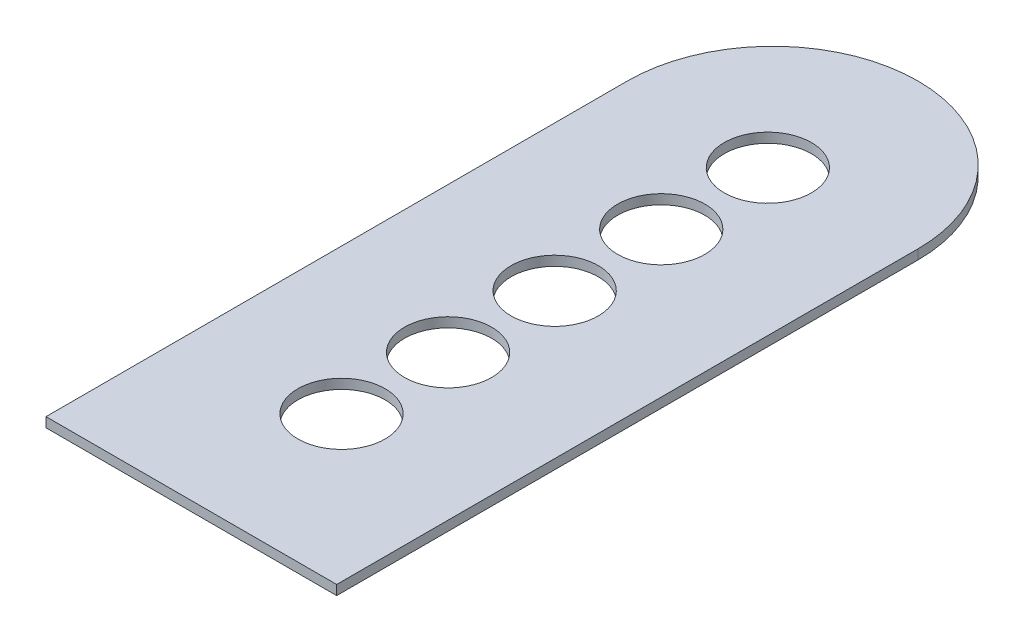
ISO-10303-21;
HEADER;
FILE_DESCRIPTION(('STEP AP214'),'2;1');
FILE_NAME('part.step','',(''),(''),'','','');
FILE_SCHEMA(('AUTOMOTIVE_DESIGN { 1 0 10303 214 1 1 1 1 }'));
ENDSEC;
DATA;
#1=APPLICATION_CONTEXT('core data for automotive mechanical design processes');
#2=APPLICATION_PROTOCOL_DEFINITION('international standard','automotive_design',2000,#1);
#3=PRODUCT_CONTEXT('',#1,'mechanical');
#4=PRODUCT('Part','Part','',(#3));
#5=PRODUCT_RELATED_PRODUCT_CATEGORY('part','',(#4));
#6=PRODUCT_DEFINITION_FORMATION('','',#4);
#7=PRODUCT_DEFINITION_CONTEXT('part definition',#1,'design');
#8=PRODUCT_DEFINITION('design','',#6,#7);
#9=PRODUCT_DEFINITION_SHAPE('','',#8);
#10=(LENGTH_UNIT() NAMED_UNIT(*) SI_UNIT(.MILLI.,.METRE.));
#11=(NAMED_UNIT(*) PLANE_ANGLE_UNIT() SI_UNIT($,.RADIAN.));
#12=(NAMED_UNIT(*) SI_UNIT($,.STERADIAN.) SOLID_ANGLE_UNIT());
#13=UNCERTAINTY_MEASURE_WITH_UNIT(LENGTH_MEASURE(1.E-05),#10,'distance_accuracy_value','');
#14=(GEOMETRIC_REPRESENTATION_CONTEXT(3) GLOBAL_UNCERTAINTY_ASSIGNED_CONTEXT((#13)) GLOBAL_UNIT_ASSIGNED_CONTEXT((#10,
#11,#12)) REPRESENTATION_CONTEXT('',''));
#15=CARTESIAN_POINT('',(0.,0.,0.));
#16=DIRECTION('',(0.,0.,1.));
#17=DIRECTION('',(1.,0.,0.));
#18=AXIS2_PLACEMENT_3D('',#15,#16,#17);
#19=CARTESIAN_POINT('',(150.,10.,-600.));
#20=DIRECTION('',(0.,1.,0.));
#21=DIRECTION('',(0.,0.,1.));
#22=AXIS2_PLACEMENT_3D('',#19,#20,#21);
#23=PLANE('',#22);
#24=CARTESIAN_POINT('',(150.,10.,-485.));
#25=DIRECTION('',(0.,1.,0.));
#26=DIRECTION('',(0.,0.,1.));
#27=AXIS2_PLACEMENT_3D('',#24,#25,#26);
#28=CIRCLE('',#27,45.);
#29=CARTESIAN_POINT('',(150.,10.,-440.));
#30=VERTEX_POINT('',#29);
#31=EDGE_CURVE('E128',#30,#30,#28,.T.);
#32=ORIENTED_EDGE('',*,*,#31,.F.);
#33=EDGE_LOOP('',(#32));
#34=FACE_BOUND('',#33,.T.);
#35=CARTESIAN_POINT('',(150.,10.,-155.));
#36=DIRECTION('',(0.,1.,0.));
#37=DIRECTION('',(0.,0.,1.));
#38=AXIS2_PLACEMENT_3D('',#35,#36,#37);
#39=CIRCLE('',#38,45.);
#40=CARTESIAN_POINT('',(150.,10.,-110.));
#41=VERTEX_POINT('',#40);
#42=EDGE_CURVE('E116',#41,#41,#39,.T.);
#43=ORIENTED_EDGE('',*,*,#42,.F.);
#44=EDGE_LOOP('',(#43));
#45=FACE_BOUND('',#44,.T.);
#46=DIRECTION('',(1.,0.,0.));
#47=VECTOR('',#46,1.);
#48=CARTESIAN_POINT('',(0.,10.,0.));
#49=LINE('',#48,#47);
#50=CARTESIAN_POINT('',(0.,10.,0.));
#51=VERTEX_POINT('',#50);
#52=CARTESIAN_POINT('',(300.,10.,0.));
#53=VERTEX_POINT('',#52);
#54=EDGE_CURVE('E86',#51,#53,#49,.T.);
#55=ORIENTED_EDGE('',*,*,#54,.T.);
#56=DIRECTION('',(0.,0.,-1.));
#57=VECTOR('',#56,1.);
#58=CARTESIAN_POINT('',(300.,10.,0.));
#59=LINE('',#58,#57);
#60=CARTESIAN_POINT('',(300.,10.,-600.));
#61=VERTEX_POINT('',#60);
#62=EDGE_CURVE('E81',#53,#61,#59,.T.);
#63=ORIENTED_EDGE('',*,*,#62,.T.);
#64=CARTESIAN_POINT('',(150.,10.,-600.));
#65=DIRECTION('',(0.,1.,0.));
#66=DIRECTION('',(0.,0.,1.));
#67=AXIS2_PLACEMENT_3D('',#64,#65,#66);
#68=CIRCLE('',#67,150.);
#69=CARTESIAN_POINT('',(0.,10.,-600.));
#70=VERTEX_POINT('',#69);
#71=EDGE_CURVE('E84',#61,#70,#68,.T.);
#72=ORIENTED_EDGE('',*,*,#71,.T.);
#73=DIRECTION('',(0.,0.,1.));
#74=VECTOR('',#73,1.);
#75=CARTESIAN_POINT('',(0.,10.,0.));
#76=LINE('',#75,#74);
#77=EDGE_CURVE('E51',#70,#51,#76,.T.);
#78=ORIENTED_EDGE('',*,*,#77,.T.);
#79=EDGE_LOOP('',(#55,#63,#72,#78));
#80=FACE_BOUND('',#79,.T.);
#81=CARTESIAN_POINT('',(150.,10.,-595.));
#82=DIRECTION('',(0.,1.,0.));
#83=DIRECTION('',(0.,0.,1.));
#84=AXIS2_PLACEMENT_3D('',#81,#82,#83);
#85=CIRCLE('',#84,45.);
#86=CARTESIAN_POINT('',(150.,10.,-550.));
#87=VERTEX_POINT('',#86);
#88=EDGE_CURVE('E101',#87,#87,#85,.T.);
#89=ORIENTED_EDGE('',*,*,#88,.F.);
#90=EDGE_LOOP('',(#89));
#91=FACE_BOUND('',#90,.T.);
#92=CARTESIAN_POINT('',(150.,10.,-265.));
#93=DIRECTION('',(0.,1.,0.));
#94=DIRECTION('',(0.,0.,1.));
#95=AXIS2_PLACEMENT_3D('',#92,#93,#94);
#96=CIRCLE('',#95,45.);
#97=CARTESIAN_POINT('',(150.,10.,-220.));
#98=VERTEX_POINT('',#97);
#99=EDGE_CURVE('E122',#98,#98,#96,.T.);
#100=ORIENTED_EDGE('',*,*,#99,.F.);
#101=EDGE_LOOP('',(#100));
#102=FACE_BOUND('',#101,.T.);
#103=CARTESIAN_POINT('',(150.,10.,-375.));
#104=DIRECTION('',(0.,1.,0.));
#105=DIRECTION('',(0.,0.,1.));
#106=AXIS2_PLACEMENT_3D('',#103,#104,#105);
#107=CIRCLE('',#106,45.);
#108=CARTESIAN_POINT('',(150.,10.,-330.));
#109=VERTEX_POINT('',#108);
#110=EDGE_CURVE('E134',#109,#109,#107,.T.);
#111=ORIENTED_EDGE('',*,*,#110,.F.);
#112=EDGE_LOOP('',(#111));
#113=FACE_BOUND('',#112,.T.);
#114=ADVANCED_FACE('F34',(#34,#45,#80,#91,#102,#113),#23,.T.);
#115=CARTESIAN_POINT('',(150.,0.,-600.));
#116=DIRECTION('',(0.,1.,0.));
#117=DIRECTION('',(0.,0.,1.));
#118=AXIS2_PLACEMENT_3D('',#115,#116,#117);
#119=PLANE('',#118);
#120=DIRECTION('',(1.,0.,0.));
#121=VECTOR('',#120,1.);
#122=CARTESIAN_POINT('',(0.,0.,0.));
#123=LINE('',#122,#121);
#124=CARTESIAN_POINT('',(0.,0.,0.));
#125=VERTEX_POINT('',#124);
#126=CARTESIAN_POINT('',(300.,0.,0.));
#127=VERTEX_POINT('',#126);
#128=EDGE_CURVE('E98',#125,#127,#123,.T.);
#129=ORIENTED_EDGE('',*,*,#128,.F.);
#130=DIRECTION('',(0.,0.,1.));
#131=VECTOR('',#130,1.);
#132=CARTESIAN_POINT('',(0.,0.,0.));
#133=LINE('',#132,#131);
#134=CARTESIAN_POINT('',(0.,0.,-600.));
#135=VERTEX_POINT('',#134);
#136=EDGE_CURVE('E74',#135,#125,#133,.T.);
#137=ORIENTED_EDGE('',*,*,#136,.F.);
#138=CARTESIAN_POINT('',(150.,0.,-600.));
#139=DIRECTION('',(0.,1.,0.));
#140=DIRECTION('',(0.,0.,1.));
#141=AXIS2_PLACEMENT_3D('',#138,#139,#140);
#142=CIRCLE('',#141,150.);
#143=CARTESIAN_POINT('',(300.,0.,-600.));
#144=VERTEX_POINT('',#143);
#145=EDGE_CURVE('E68',#144,#135,#142,.T.);
#146=ORIENTED_EDGE('',*,*,#145,.F.);
#147=DIRECTION('',(0.,0.,-1.));
#148=VECTOR('',#147,1.);
#149=CARTESIAN_POINT('',(300.,0.,0.));
#150=LINE('',#149,#148);
#151=EDGE_CURVE('E90',#127,#144,#150,.T.);
#152=ORIENTED_EDGE('',*,*,#151,.F.);
#153=EDGE_LOOP('',(#129,#137,#146,#152));
#154=FACE_BOUND('',#153,.T.);
#155=CARTESIAN_POINT('',(150.,0.,-595.));
#156=DIRECTION('',(0.,1.,0.));
#157=DIRECTION('',(0.,0.,1.));
#158=AXIS2_PLACEMENT_3D('',#155,#156,#157);
#159=CIRCLE('',#158,45.);
#160=CARTESIAN_POINT('',(150.,0.,-550.));
#161=VERTEX_POINT('',#160);
#162=EDGE_CURVE('E113',#161,#161,#159,.T.);
#163=ORIENTED_EDGE('',*,*,#162,.T.);
#164=EDGE_LOOP('',(#163));
#165=FACE_BOUND('',#164,.T.);
#166=CARTESIAN_POINT('',(150.,0.,-155.));
#167=DIRECTION('',(0.,1.,0.));
#168=DIRECTION('',(0.,0.,1.));
#169=AXIS2_PLACEMENT_3D('',#166,#167,#168);
#170=CIRCLE('',#169,45.);
#171=CARTESIAN_POINT('',(150.,0.,-110.));
#172=VERTEX_POINT('',#171);
#173=EDGE_CURVE('E119',#172,#172,#170,.T.);
#174=ORIENTED_EDGE('',*,*,#173,.T.);
#175=EDGE_LOOP('',(#174));
#176=FACE_BOUND('',#175,.T.);
#177=CARTESIAN_POINT('',(150.,0.,-265.));
#178=DIRECTION('',(0.,1.,0.));
#179=DIRECTION('',(0.,0.,1.));
#180=AXIS2_PLACEMENT_3D('',#177,#178,#179);
#181=CIRCLE('',#180,45.);
#182=CARTESIAN_POINT('',(150.,0.,-220.));
#183=VERTEX_POINT('',#182);
#184=EDGE_CURVE('E125',#183,#183,#181,.T.);
#185=ORIENTED_EDGE('',*,*,#184,.T.);
#186=EDGE_LOOP('',(#185));
#187=FACE_BOUND('',#186,.T.);
#188=CARTESIAN_POINT('',(150.,0.,-485.));
#189=DIRECTION('',(0.,1.,0.));
#190=DIRECTION('',(0.,0.,1.));
#191=AXIS2_PLACEMENT_3D('',#188,#189,#190);
#192=CIRCLE('',#191,45.);
#193=CARTESIAN_POINT('',(150.,0.,-440.));
#194=VERTEX_POINT('',#193);
#195=EDGE_CURVE('E131',#194,#194,#192,.T.);
#196=ORIENTED_EDGE('',*,*,#195,.T.);
#197=EDGE_LOOP('',(#196));
#198=FACE_BOUND('',#197,.T.);
#199=CARTESIAN_POINT('',(150.,0.,-375.));
#200=DIRECTION('',(0.,1.,0.));
#201=DIRECTION('',(0.,0.,1.));
#202=AXIS2_PLACEMENT_3D('',#199,#200,#201);
#203=CIRCLE('',#202,45.);
#204=CARTESIAN_POINT('',(150.,0.,-330.));
#205=VERTEX_POINT('',#204);
#206=EDGE_CURVE('E137',#205,#205,#203,.T.);
#207=ORIENTED_EDGE('',*,*,#206,.T.);
#208=EDGE_LOOP('',(#207));
#209=FACE_BOUND('',#208,.T.);
#210=ADVANCED_FACE('F109',(#154,#165,#176,#187,#198,#209),#119,.F.);
#211=CARTESIAN_POINT('',(0.,10.,0.));
#212=DIRECTION('',(0.,0.,-1.));
#213=DIRECTION('',(-1.,0.,0.));
#214=AXIS2_PLACEMENT_3D('',#211,#212,#213);
#215=PLANE('',#214);
#216=ORIENTED_EDGE('',*,*,#128,.T.);
#217=DIRECTION('',(0.,-1.,0.));
#218=VECTOR('',#217,1.);
#219=CARTESIAN_POINT('',(300.,10.,0.));
#220=LINE('',#219,#218);
#221=EDGE_CURVE('E11',#53,#127,#220,.T.);
#222=ORIENTED_EDGE('',*,*,#221,.F.);
#223=ORIENTED_EDGE('',*,*,#54,.F.);
#224=DIRECTION('',(0.,-1.,0.));
#225=VECTOR('',#224,1.);
#226=CARTESIAN_POINT('',(0.,10.,0.));
#227=LINE('',#226,#225);
#228=EDGE_CURVE('E94',#51,#125,#227,.T.);
#229=ORIENTED_EDGE('',*,*,#228,.T.);
#230=EDGE_LOOP('',(#216,#222,#223,#229));
#231=FACE_BOUND('',#230,.T.);
#232=ADVANCED_FACE('F36',(#231),#215,.F.);
#233=CARTESIAN_POINT('',(300.,10.,0.));
#234=DIRECTION('',(-1.,0.,0.));
#235=DIRECTION('',(0.,0.,1.));
#236=AXIS2_PLACEMENT_3D('',#233,#234,#235);
#237=PLANE('',#236);
#238=ORIENTED_EDGE('',*,*,#151,.T.);
#239=DIRECTION('',(0.,-1.,0.));
#240=VECTOR('',#239,1.);
#241=CARTESIAN_POINT('',(300.,10.,-600.));
#242=LINE('',#241,#240);
#243=EDGE_CURVE('E43',#61,#144,#242,.T.);
#244=ORIENTED_EDGE('',*,*,#243,.F.);
#245=ORIENTED_EDGE('',*,*,#62,.F.);
#246=ORIENTED_EDGE('',*,*,#221,.T.);
#247=EDGE_LOOP('',(#238,#244,#245,#246));
#248=FACE_BOUND('',#247,.T.);
#249=ADVANCED_FACE('F89',(#248),#237,.F.);
#250=CARTESIAN_POINT('',(150.,10.,-600.));
#251=DIRECTION('',(0.,-1.,0.));
#252=DIRECTION('',(0.,0.,-1.));
#253=AXIS2_PLACEMENT_3D('',#250,#251,#252);
#254=CYLINDRICAL_SURFACE('',#253,150.);
#255=ORIENTED_EDGE('',*,*,#145,.T.);
#256=DIRECTION('',(0.,-1.,0.));
#257=VECTOR('',#256,1.);
#258=CARTESIAN_POINT('',(0.,10.,-600.));
#259=LINE('',#258,#257);
#260=EDGE_CURVE('E91',#70,#135,#259,.T.);
#261=ORIENTED_EDGE('',*,*,#260,.F.);
#262=ORIENTED_EDGE('',*,*,#71,.F.);
#263=ORIENTED_EDGE('',*,*,#243,.T.);
#264=EDGE_LOOP('',(#255,#261,#262,#263));
#265=FACE_BOUND('',#264,.T.);
#266=ADVANCED_FACE('F92',(#265),#254,.T.);
#267=CARTESIAN_POINT('',(0.,10.,0.));
#268=DIRECTION('',(1.,0.,0.));
#269=DIRECTION('',(0.,0.,-1.));
#270=AXIS2_PLACEMENT_3D('',#267,#268,#269);
#271=PLANE('',#270);
#272=ORIENTED_EDGE('',*,*,#136,.T.);
#273=ORIENTED_EDGE('',*,*,#228,.F.);
#274=ORIENTED_EDGE('',*,*,#77,.F.);
#275=ORIENTED_EDGE('',*,*,#260,.T.);
#276=EDGE_LOOP('',(#272,#273,#274,#275));
#277=FACE_BOUND('',#276,.T.);
#278=ADVANCED_FACE('F106',(#277),#271,.F.);
#279=CARTESIAN_POINT('',(150.,10.,-595.));
#280=DIRECTION('',(0.,-1.,0.));
#281=DIRECTION('',(0.,0.,-1.));
#282=AXIS2_PLACEMENT_3D('',#279,#280,#281);
#283=CYLINDRICAL_SURFACE('',#282,45.);
#284=ORIENTED_EDGE('',*,*,#88,.T.);
#285=EDGE_LOOP('',(#284));
#286=FACE_BOUND('',#285,.T.);
#287=ORIENTED_EDGE('',*,*,#162,.F.);
#288=EDGE_LOOP('',(#287));
#289=FACE_BOUND('',#288,.T.);
#290=ADVANCED_FACE('F156',(#286,#289),#283,.F.);
#291=CARTESIAN_POINT('',(150.,10.,-155.));
#292=DIRECTION('',(0.,-1.,0.));
#293=DIRECTION('',(0.,0.,-1.));
#294=AXIS2_PLACEMENT_3D('',#291,#292,#293);
#295=CYLINDRICAL_SURFACE('',#294,45.);
#296=ORIENTED_EDGE('',*,*,#42,.T.);
#297=EDGE_LOOP('',(#296));
#298=FACE_BOUND('',#297,.T.);
#299=ORIENTED_EDGE('',*,*,#173,.F.);
#300=EDGE_LOOP('',(#299));
#301=FACE_BOUND('',#300,.T.);
#302=ADVANCED_FACE('F202',(#298,#301),#295,.F.);
#303=CARTESIAN_POINT('',(150.,10.,-265.));
#304=DIRECTION('',(0.,-1.,0.));
#305=DIRECTION('',(0.,0.,-1.));
#306=AXIS2_PLACEMENT_3D('',#303,#304,#305);
#307=CYLINDRICAL_SURFACE('',#306,45.);
#308=ORIENTED_EDGE('',*,*,#99,.T.);
#309=EDGE_LOOP('',(#308));
#310=FACE_BOUND('',#309,.T.);
#311=ORIENTED_EDGE('',*,*,#184,.F.);
#312=EDGE_LOOP('',(#311));
#313=FACE_BOUND('',#312,.T.);
#314=ADVANCED_FACE('F210',(#310,#313),#307,.F.);
#315=CARTESIAN_POINT('',(150.,10.,-485.));
#316=DIRECTION('',(0.,-1.,0.));
#317=DIRECTION('',(0.,0.,-1.));
#318=AXIS2_PLACEMENT_3D('',#315,#316,#317);
#319=CYLINDRICAL_SURFACE('',#318,45.);
#320=ORIENTED_EDGE('',*,*,#31,.T.);
#321=EDGE_LOOP('',(#320));
#322=FACE_BOUND('',#321,.T.);
#323=ORIENTED_EDGE('',*,*,#195,.F.);
#324=EDGE_LOOP('',(#323));
#325=FACE_BOUND('',#324,.T.);
#326=ADVANCED_FACE('F218',(#322,#325),#319,.F.);
#327=CARTESIAN_POINT('',(150.,10.,-375.));
#328=DIRECTION('',(0.,-1.,0.));
#329=DIRECTION('',(0.,0.,-1.));
#330=AXIS2_PLACEMENT_3D('',#327,#328,#329);
#331=CYLINDRICAL_SURFACE('',#330,45.);
#332=ORIENTED_EDGE('',*,*,#110,.T.);
#333=EDGE_LOOP('',(#332));
#334=FACE_BOUND('',#333,.T.);
#335=ORIENTED_EDGE('',*,*,#206,.F.);
#336=EDGE_LOOP('',(#335));
#337=FACE_BOUND('',#336,.T.);
#338=ADVANCED_FACE('F143',(#334,#337),#331,.F.);
#339=CLOSED_SHELL('',(#114,#210,#232,#249,#266,#278,#290,#302,#314,#326,#338));
#340=MANIFOLD_SOLID_BREP('B2',#339);
#341=ADVANCED_BREP_SHAPE_REPRESENTATION('',(#18,#340),#14);
#342=SHAPE_DEFINITION_REPRESENTATION(#9,#341);
ENDSEC;
END-ISO-10303-21;
